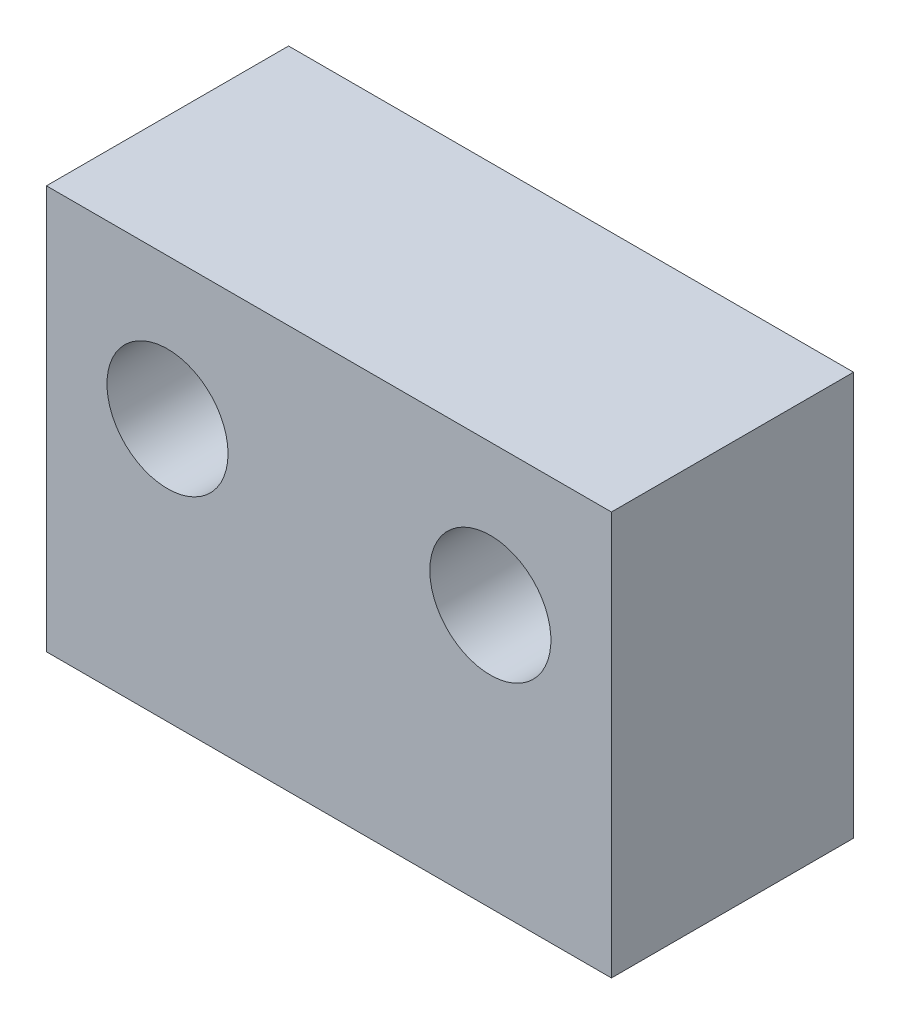
ISO-10303-21;
HEADER;
FILE_DESCRIPTION(('STEP AP214'),'2;1');
FILE_NAME('part.step','',(''),(''),'','','');
FILE_SCHEMA(('AUTOMOTIVE_DESIGN { 1 0 10303 214 1 1 1 1 }'));
ENDSEC;
DATA;
#1=APPLICATION_CONTEXT('core data for automotive mechanical design processes');
#2=APPLICATION_PROTOCOL_DEFINITION('international standard','automotive_design',2000,#1);
#3=PRODUCT_CONTEXT('',#1,'mechanical');
#4=PRODUCT('Part','Part','',(#3));
#5=PRODUCT_RELATED_PRODUCT_CATEGORY('part','',(#4));
#6=PRODUCT_DEFINITION_FORMATION('','',#4);
#7=PRODUCT_DEFINITION_CONTEXT('part definition',#1,'design');
#8=PRODUCT_DEFINITION('design','',#6,#7);
#9=PRODUCT_DEFINITION_SHAPE('','',#8);
#10=(LENGTH_UNIT() NAMED_UNIT(*) SI_UNIT(.MILLI.,.METRE.));
#11=(NAMED_UNIT(*) PLANE_ANGLE_UNIT() SI_UNIT($,.RADIAN.));
#12=(NAMED_UNIT(*) SI_UNIT($,.STERADIAN.) SOLID_ANGLE_UNIT());
#13=UNCERTAINTY_MEASURE_WITH_UNIT(LENGTH_MEASURE(1.E-05),#10,'distance_accuracy_value','');
#14=(GEOMETRIC_REPRESENTATION_CONTEXT(3) GLOBAL_UNCERTAINTY_ASSIGNED_CONTEXT((#13)) GLOBAL_UNIT_ASSIGNED_CONTEXT((#10,
#11,#12)) REPRESENTATION_CONTEXT('',''));
#15=CARTESIAN_POINT('',(0.,0.,0.));
#16=DIRECTION('',(0.,0.,1.));
#17=DIRECTION('',(1.,0.,0.));
#18=AXIS2_PLACEMENT_3D('',#15,#16,#17);
#19=CARTESIAN_POINT('',(7.,5.,6.));
#20=DIRECTION('',(-1.,0.,0.));
#21=DIRECTION('',(0.,0.,1.));
#22=AXIS2_PLACEMENT_3D('',#19,#20,#21);
#23=PLANE('',#22);
#24=DIRECTION('',(0.,1.,0.));
#25=VECTOR('',#24,1.);
#26=CARTESIAN_POINT('',(7.,5.,0.));
#27=LINE('',#26,#25);
#28=CARTESIAN_POINT('',(7.,-5.,0.));
#29=VERTEX_POINT('',#28);
#30=CARTESIAN_POINT('',(7.,5.,0.));
#31=VERTEX_POINT('',#30);
#32=EDGE_CURVE('E107',#29,#31,#27,.T.);
#33=ORIENTED_EDGE('',*,*,#32,.T.);
#34=DIRECTION('',(0.,0.,-1.));
#35=VECTOR('',#34,1.);
#36=CARTESIAN_POINT('',(7.,5.,6.));
#37=LINE('',#36,#35);
#38=CARTESIAN_POINT('',(7.,5.,6.));
#39=VERTEX_POINT('',#38);
#40=EDGE_CURVE('E11',#39,#31,#37,.T.);
#41=ORIENTED_EDGE('',*,*,#40,.F.);
#42=DIRECTION('',(0.,1.,0.));
#43=VECTOR('',#42,1.);
#44=CARTESIAN_POINT('',(7.,5.,6.));
#45=LINE('',#44,#43);
#46=CARTESIAN_POINT('',(7.,-5.,6.));
#47=VERTEX_POINT('',#46);
#48=EDGE_CURVE('E91',#47,#39,#45,.T.);
#49=ORIENTED_EDGE('',*,*,#48,.F.);
#50=DIRECTION('',(0.,0.,-1.));
#51=VECTOR('',#50,1.);
#52=CARTESIAN_POINT('',(7.,-5.,6.));
#53=LINE('',#52,#51);
#54=EDGE_CURVE('E103',#47,#29,#53,.T.);
#55=ORIENTED_EDGE('',*,*,#54,.T.);
#56=EDGE_LOOP('',(#33,#41,#49,#55));
#57=FACE_BOUND('',#56,.T.);
#58=ADVANCED_FACE('F39',(#57),#23,.F.);
#59=CARTESIAN_POINT('',(-7.,5.,6.));
#60=DIRECTION('',(0.,-1.,0.));
#61=DIRECTION('',(0.,0.,-1.));
#62=AXIS2_PLACEMENT_3D('',#59,#60,#61);
#63=PLANE('',#62);
#64=DIRECTION('',(-1.,0.,0.));
#65=VECTOR('',#64,1.);
#66=CARTESIAN_POINT('',(-7.,5.,0.));
#67=LINE('',#66,#65);
#68=CARTESIAN_POINT('',(-7.,5.,0.));
#69=VERTEX_POINT('',#68);
#70=EDGE_CURVE('E96',#31,#69,#67,.T.);
#71=ORIENTED_EDGE('',*,*,#70,.T.);
#72=DIRECTION('',(0.,0.,-1.));
#73=VECTOR('',#72,1.);
#74=CARTESIAN_POINT('',(-7.,5.,6.));
#75=LINE('',#74,#73);
#76=CARTESIAN_POINT('',(-7.,5.,6.));
#77=VERTEX_POINT('',#76);
#78=EDGE_CURVE('E48',#77,#69,#75,.T.);
#79=ORIENTED_EDGE('',*,*,#78,.F.);
#80=DIRECTION('',(-1.,0.,0.));
#81=VECTOR('',#80,1.);
#82=CARTESIAN_POINT('',(-7.,5.,6.));
#83=LINE('',#82,#81);
#84=EDGE_CURVE('E86',#39,#77,#83,.T.);
#85=ORIENTED_EDGE('',*,*,#84,.F.);
#86=ORIENTED_EDGE('',*,*,#40,.T.);
#87=EDGE_LOOP('',(#71,#79,#85,#86));
#88=FACE_BOUND('',#87,.T.);
#89=ADVANCED_FACE('F95',(#88),#63,.F.);
#90=CARTESIAN_POINT('',(-7.,5.,6.));
#91=DIRECTION('',(1.,0.,0.));
#92=DIRECTION('',(0.,0.,-1.));
#93=AXIS2_PLACEMENT_3D('',#90,#91,#92);
#94=PLANE('',#93);
#95=DIRECTION('',(0.,-1.,0.));
#96=VECTOR('',#95,1.);
#97=CARTESIAN_POINT('',(-7.,5.,0.));
#98=LINE('',#97,#96);
#99=CARTESIAN_POINT('',(-7.,-5.,0.));
#100=VERTEX_POINT('',#99);
#101=EDGE_CURVE('E73',#69,#100,#98,.T.);
#102=ORIENTED_EDGE('',*,*,#101,.T.);
#103=DIRECTION('',(0.,0.,-1.));
#104=VECTOR('',#103,1.);
#105=CARTESIAN_POINT('',(-7.,-5.,6.));
#106=LINE('',#105,#104);
#107=CARTESIAN_POINT('',(-7.,-5.,6.));
#108=VERTEX_POINT('',#107);
#109=EDGE_CURVE('E98',#108,#100,#106,.T.);
#110=ORIENTED_EDGE('',*,*,#109,.F.);
#111=DIRECTION('',(0.,-1.,0.));
#112=VECTOR('',#111,1.);
#113=CARTESIAN_POINT('',(-7.,5.,6.));
#114=LINE('',#113,#112);
#115=EDGE_CURVE('E89',#77,#108,#114,.T.);
#116=ORIENTED_EDGE('',*,*,#115,.F.);
#117=ORIENTED_EDGE('',*,*,#78,.T.);
#118=EDGE_LOOP('',(#102,#110,#116,#117));
#119=FACE_BOUND('',#118,.T.);
#120=ADVANCED_FACE('F99',(#119),#94,.F.);
#121=CARTESIAN_POINT('',(-7.,-5.,6.));
#122=DIRECTION('',(0.,1.,0.));
#123=DIRECTION('',(0.,0.,1.));
#124=AXIS2_PLACEMENT_3D('',#121,#122,#123);
#125=PLANE('',#124);
#126=DIRECTION('',(1.,0.,0.));
#127=VECTOR('',#126,1.);
#128=CARTESIAN_POINT('',(-7.,-5.,0.));
#129=LINE('',#128,#127);
#130=EDGE_CURVE('E79',#100,#29,#129,.T.);
#131=ORIENTED_EDGE('',*,*,#130,.T.);
#132=ORIENTED_EDGE('',*,*,#54,.F.);
#133=DIRECTION('',(1.,0.,0.));
#134=VECTOR('',#133,1.);
#135=CARTESIAN_POINT('',(-7.,-5.,6.));
#136=LINE('',#135,#134);
#137=EDGE_CURVE('E56',#108,#47,#136,.T.);
#138=ORIENTED_EDGE('',*,*,#137,.F.);
#139=ORIENTED_EDGE('',*,*,#109,.T.);
#140=EDGE_LOOP('',(#131,#132,#138,#139));
#141=FACE_BOUND('',#140,.T.);
#142=ADVANCED_FACE('F121',(#141),#125,.F.);
#143=CARTESIAN_POINT('',(0.,0.,6.));
#144=DIRECTION('',(0.,0.,1.));
#145=DIRECTION('',(1.,0.,0.));
#146=AXIS2_PLACEMENT_3D('',#143,#144,#145);
#147=PLANE('',#146);
#148=CARTESIAN_POINT('',(-4.,1.5,6.));
#149=DIRECTION('',(0.,0.,1.));
#150=DIRECTION('',(1.,0.,0.));
#151=AXIS2_PLACEMENT_3D('',#148,#149,#150);
#152=CIRCLE('',#151,1.5);
#153=CARTESIAN_POINT('',(-2.5,1.5,6.));
#154=VERTEX_POINT('',#153);
#155=EDGE_CURVE('E136',#154,#154,#152,.T.);
#156=ORIENTED_EDGE('',*,*,#155,.F.);
#157=EDGE_LOOP('',(#156));
#158=FACE_BOUND('',#157,.T.);
#159=CARTESIAN_POINT('',(4.,1.5,6.));
#160=DIRECTION('',(0.,0.,1.));
#161=DIRECTION('',(-1.,0.,0.));
#162=AXIS2_PLACEMENT_3D('',#159,#160,#161);
#163=CIRCLE('',#162,1.5);
#164=CARTESIAN_POINT('',(2.5,1.5,6.));
#165=VERTEX_POINT('',#164);
#166=EDGE_CURVE('E128',#165,#165,#163,.T.);
#167=ORIENTED_EDGE('',*,*,#166,.F.);
#168=EDGE_LOOP('',(#167));
#169=FACE_BOUND('',#168,.T.);
#170=ORIENTED_EDGE('',*,*,#48,.T.);
#171=ORIENTED_EDGE('',*,*,#84,.T.);
#172=ORIENTED_EDGE('',*,*,#115,.T.);
#173=ORIENTED_EDGE('',*,*,#137,.T.);
#174=EDGE_LOOP('',(#170,#171,#172,#173));
#175=FACE_BOUND('',#174,.T.);
#176=ADVANCED_FACE('F87',(#158,#169,#175),#147,.T.);
#177=CARTESIAN_POINT('',(0.,0.,0.));
#178=DIRECTION('',(0.,0.,1.));
#179=DIRECTION('',(1.,0.,0.));
#180=AXIS2_PLACEMENT_3D('',#177,#178,#179);
#181=PLANE('',#180);
#182=CARTESIAN_POINT('',(-4.,1.5,0.));
#183=DIRECTION('',(0.,0.,1.));
#184=DIRECTION('',(1.,0.,0.));
#185=AXIS2_PLACEMENT_3D('',#182,#183,#184);
#186=CIRCLE('',#185,1.5);
#187=CARTESIAN_POINT('',(-2.5,1.5,0.));
#188=VERTEX_POINT('',#187);
#189=EDGE_CURVE('E111',#188,#188,#186,.T.);
#190=ORIENTED_EDGE('',*,*,#189,.T.);
#191=EDGE_LOOP('',(#190));
#192=FACE_BOUND('',#191,.T.);
#193=CARTESIAN_POINT('',(4.,1.5,0.));
#194=DIRECTION('',(0.,0.,1.));
#195=DIRECTION('',(-1.,0.,0.));
#196=AXIS2_PLACEMENT_3D('',#193,#194,#195);
#197=CIRCLE('',#196,1.5);
#198=CARTESIAN_POINT('',(2.5,1.5,0.));
#199=VERTEX_POINT('',#198);
#200=EDGE_CURVE('E132',#199,#199,#197,.T.);
#201=ORIENTED_EDGE('',*,*,#200,.T.);
#202=EDGE_LOOP('',(#201));
#203=FACE_BOUND('',#202,.T.);
#204=ORIENTED_EDGE('',*,*,#32,.F.);
#205=ORIENTED_EDGE('',*,*,#130,.F.);
#206=ORIENTED_EDGE('',*,*,#101,.F.);
#207=ORIENTED_EDGE('',*,*,#70,.F.);
#208=EDGE_LOOP('',(#204,#205,#206,#207));
#209=FACE_BOUND('',#208,.T.);
#210=ADVANCED_FACE('F124',(#192,#203,#209),#181,.F.);
#211=CARTESIAN_POINT('',(4.,1.5,0.));
#212=DIRECTION('',(0.,0.,1.));
#213=DIRECTION('',(1.,0.,0.));
#214=AXIS2_PLACEMENT_3D('',#211,#212,#213);
#215=CYLINDRICAL_SURFACE('',#214,1.5);
#216=ORIENTED_EDGE('',*,*,#200,.F.);
#217=EDGE_LOOP('',(#216));
#218=FACE_BOUND('',#217,.T.);
#219=ORIENTED_EDGE('',*,*,#166,.T.);
#220=EDGE_LOOP('',(#219));
#221=FACE_BOUND('',#220,.T.);
#222=ADVANCED_FACE('F149',(#218,#221),#215,.F.);
#223=CARTESIAN_POINT('',(-4.,1.5,0.));
#224=DIRECTION('',(0.,0.,1.));
#225=DIRECTION('',(1.,0.,0.));
#226=AXIS2_PLACEMENT_3D('',#223,#224,#225);
#227=CYLINDRICAL_SURFACE('',#226,1.5);
#228=ORIENTED_EDGE('',*,*,#189,.F.);
#229=EDGE_LOOP('',(#228));
#230=FACE_BOUND('',#229,.T.);
#231=ORIENTED_EDGE('',*,*,#155,.T.);
#232=EDGE_LOOP('',(#231));
#233=FACE_BOUND('',#232,.T.);
#234=ADVANCED_FACE('F146',(#230,#233),#227,.F.);
#235=CLOSED_SHELL('',(#58,#89,#120,#142,#176,#210,#222,#234));
#236=MANIFOLD_SOLID_BREP('B2',#235);
#237=ADVANCED_BREP_SHAPE_REPRESENTATION('',(#18,#236),#14);
#238=SHAPE_DEFINITION_REPRESENTATION(#9,#237);
ENDSEC;
END-ISO-10303-21;
